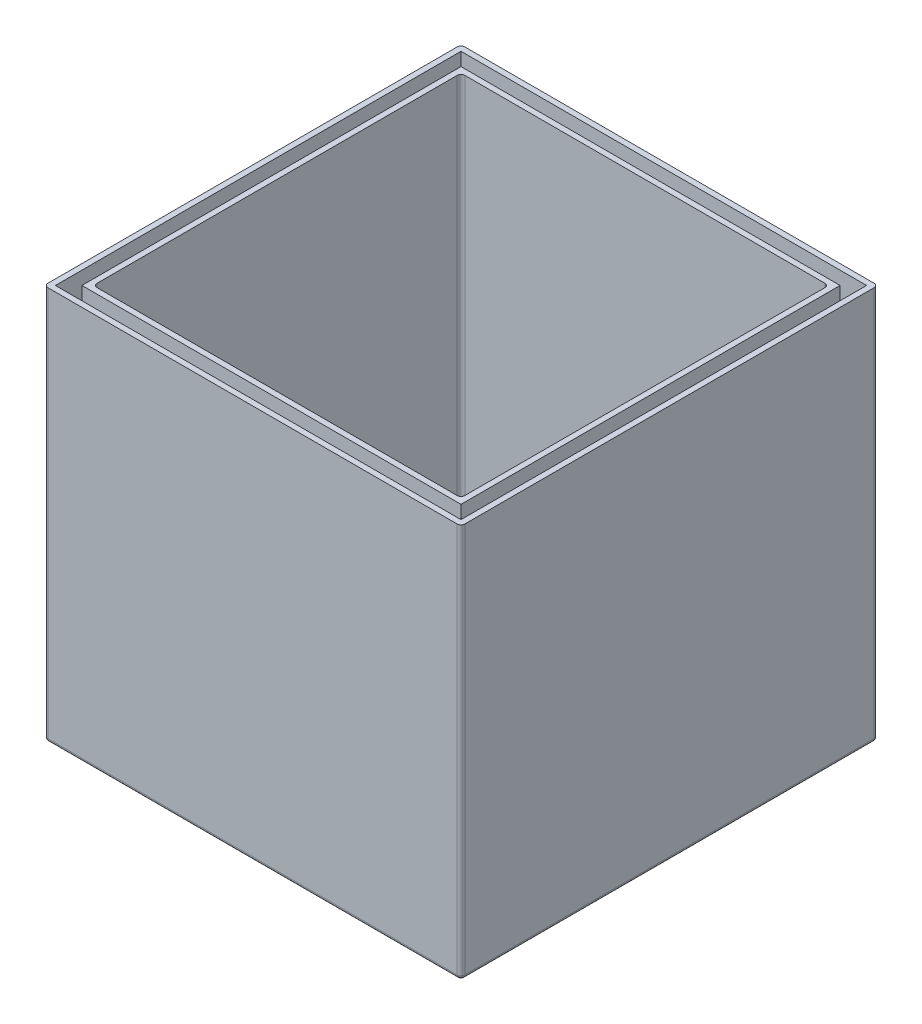
ISO-10303-21;
HEADER;
FILE_DESCRIPTION(('STEP AP214'),'2;1');
FILE_NAME('part.step','',(''),(''),'','','');
FILE_SCHEMA(('AUTOMOTIVE_DESIGN { 1 0 10303 214 1 1 1 1 }'));
ENDSEC;
DATA;
#1=APPLICATION_CONTEXT('core data for automotive mechanical design processes');
#2=APPLICATION_PROTOCOL_DEFINITION('international standard','automotive_design',2000,#1);
#3=PRODUCT_CONTEXT('',#1,'mechanical');
#4=PRODUCT('Part','Part','',(#3));
#5=PRODUCT_RELATED_PRODUCT_CATEGORY('part','',(#4));
#6=PRODUCT_DEFINITION_FORMATION('','',#4);
#7=PRODUCT_DEFINITION_CONTEXT('part definition',#1,'design');
#8=PRODUCT_DEFINITION('design','',#6,#7);
#9=PRODUCT_DEFINITION_SHAPE('','',#8);
#10=(LENGTH_UNIT() NAMED_UNIT(*) SI_UNIT(.MILLI.,.METRE.));
#11=(NAMED_UNIT(*) PLANE_ANGLE_UNIT() SI_UNIT($,.RADIAN.));
#12=(NAMED_UNIT(*) SI_UNIT($,.STERADIAN.) SOLID_ANGLE_UNIT());
#13=UNCERTAINTY_MEASURE_WITH_UNIT(LENGTH_MEASURE(1.E-05),#10,'distance_accuracy_value','');
#14=(GEOMETRIC_REPRESENTATION_CONTEXT(3) GLOBAL_UNCERTAINTY_ASSIGNED_CONTEXT((#13)) GLOBAL_UNIT_ASSIGNED_CONTEXT((#10,
#11,#12)) REPRESENTATION_CONTEXT('',''));
#15=CARTESIAN_POINT('',(0.,0.,0.));
#16=DIRECTION('',(0.,0.,1.));
#17=DIRECTION('',(1.,0.,0.));
#18=AXIS2_PLACEMENT_3D('',#15,#16,#17);
#19=CARTESIAN_POINT('',(0.,205.,-100.));
#20=DIRECTION('',(0.,0.,-1.));
#21=DIRECTION('',(-1.,0.,0.));
#22=AXIS2_PLACEMENT_3D('',#19,#20,#21);
#23=PLANE('',#22);
#24=DIRECTION('',(1.,0.,0.));
#25=VECTOR('',#24,1.);
#26=CARTESIAN_POINT('',(0.,0.,-100.));
#27=LINE('',#26,#25);
#28=CARTESIAN_POINT('',(-100.,0.,-100.));
#29=VERTEX_POINT('',#28);
#30=CARTESIAN_POINT('',(100.,0.,-100.));
#31=VERTEX_POINT('',#30);
#32=EDGE_CURVE('E411',#29,#31,#27,.T.);
#33=ORIENTED_EDGE('',*,*,#32,.F.);
#34=DIRECTION('',(0.,-1.,0.));
#35=VECTOR('',#34,1.);
#36=CARTESIAN_POINT('',(-100.,205.,-100.));
#37=LINE('',#36,#35);
#38=CARTESIAN_POINT('',(-100.,205.,-100.));
#39=VERTEX_POINT('',#38);
#40=EDGE_CURVE('E498',#39,#29,#37,.T.);
#41=ORIENTED_EDGE('',*,*,#40,.F.);
#42=DIRECTION('',(1.,0.,0.));
#43=VECTOR('',#42,1.);
#44=CARTESIAN_POINT('',(0.,205.,-100.));
#45=LINE('',#44,#43);
#46=CARTESIAN_POINT('',(100.,205.,-100.));
#47=VERTEX_POINT('',#46);
#48=EDGE_CURVE('E470',#39,#47,#45,.T.);
#49=ORIENTED_EDGE('',*,*,#48,.T.);
#50=DIRECTION('',(0.,-1.,0.));
#51=VECTOR('',#50,1.);
#52=CARTESIAN_POINT('',(100.,205.,-100.));
#53=LINE('',#52,#51);
#54=EDGE_CURVE('E481',#47,#31,#53,.T.);
#55=ORIENTED_EDGE('',*,*,#54,.T.);
#56=EDGE_LOOP('',(#33,#41,#49,#55));
#57=FACE_BOUND('',#56,.T.);
#58=ADVANCED_FACE('F214',(#57),#23,.T.);
#59=CARTESIAN_POINT('',(-100.,205.,0.));
#60=DIRECTION('',(1.,0.,0.));
#61=DIRECTION('',(0.,0.,-1.));
#62=AXIS2_PLACEMENT_3D('',#59,#60,#61);
#63=PLANE('',#62);
#64=DIRECTION('',(0.,0.,1.));
#65=VECTOR('',#64,1.);
#66=CARTESIAN_POINT('',(-100.,0.,0.));
#67=LINE('',#66,#65);
#68=CARTESIAN_POINT('',(-100.,0.,100.));
#69=VERTEX_POINT('',#68);
#70=EDGE_CURVE('E483',#29,#69,#67,.T.);
#71=ORIENTED_EDGE('',*,*,#70,.T.);
#72=DIRECTION('',(0.,-1.,0.));
#73=VECTOR('',#72,1.);
#74=CARTESIAN_POINT('',(-100.,205.,100.));
#75=LINE('',#74,#73);
#76=CARTESIAN_POINT('',(-100.,205.,100.));
#77=VERTEX_POINT('',#76);
#78=EDGE_CURVE('E495',#77,#69,#75,.T.);
#79=ORIENTED_EDGE('',*,*,#78,.F.);
#80=DIRECTION('',(0.,0.,1.));
#81=VECTOR('',#80,1.);
#82=CARTESIAN_POINT('',(-100.,205.,0.));
#83=LINE('',#82,#81);
#84=EDGE_CURVE('E473',#39,#77,#83,.T.);
#85=ORIENTED_EDGE('',*,*,#84,.F.);
#86=ORIENTED_EDGE('',*,*,#40,.T.);
#87=EDGE_LOOP('',(#71,#79,#85,#86));
#88=FACE_BOUND('',#87,.T.);
#89=ADVANCED_FACE('F719',(#88),#63,.F.);
#90=CARTESIAN_POINT('',(0.,205.,100.));
#91=DIRECTION('',(0.,0.,-1.));
#92=DIRECTION('',(-1.,0.,0.));
#93=AXIS2_PLACEMENT_3D('',#90,#91,#92);
#94=PLANE('',#93);
#95=DIRECTION('',(1.,0.,0.));
#96=VECTOR('',#95,1.);
#97=CARTESIAN_POINT('',(0.,0.,100.));
#98=LINE('',#97,#96);
#99=CARTESIAN_POINT('',(100.,0.,100.));
#100=VERTEX_POINT('',#99);
#101=EDGE_CURVE('E486',#69,#100,#98,.T.);
#102=ORIENTED_EDGE('',*,*,#101,.T.);
#103=DIRECTION('',(0.,-1.,0.));
#104=VECTOR('',#103,1.);
#105=CARTESIAN_POINT('',(100.,205.,100.));
#106=LINE('',#105,#104);
#107=CARTESIAN_POINT('',(100.,205.,100.));
#108=VERTEX_POINT('',#107);
#109=EDGE_CURVE('E492',#108,#100,#106,.T.);
#110=ORIENTED_EDGE('',*,*,#109,.F.);
#111=DIRECTION('',(1.,0.,0.));
#112=VECTOR('',#111,1.);
#113=CARTESIAN_POINT('',(0.,205.,100.));
#114=LINE('',#113,#112);
#115=EDGE_CURVE('E476',#77,#108,#114,.T.);
#116=ORIENTED_EDGE('',*,*,#115,.F.);
#117=ORIENTED_EDGE('',*,*,#78,.T.);
#118=EDGE_LOOP('',(#102,#110,#116,#117));
#119=FACE_BOUND('',#118,.T.);
#120=ADVANCED_FACE('F725',(#119),#94,.F.);
#121=CARTESIAN_POINT('',(0.,205.,-97.));
#122=DIRECTION('',(0.,0.,-1.));
#123=DIRECTION('',(-1.,0.,0.));
#124=AXIS2_PLACEMENT_3D('',#121,#122,#123);
#125=PLANE('',#124);
#126=DIRECTION('',(1.,0.,0.));
#127=VECTOR('',#126,1.);
#128=CARTESIAN_POINT('',(0.,205.,-97.));
#129=LINE('',#128,#127);
#130=CARTESIAN_POINT('',(-95.,205.,-97.));
#131=VERTEX_POINT('',#130);
#132=CARTESIAN_POINT('',(95.,205.,-97.));
#133=VERTEX_POINT('',#132);
#134=EDGE_CURVE('E457',#131,#133,#129,.T.);
#135=ORIENTED_EDGE('',*,*,#134,.F.);
#136=DIRECTION('',(0.,-1.,0.));
#137=VECTOR('',#136,1.);
#138=CARTESIAN_POINT('',(-95.,205.,-97.));
#139=LINE('',#138,#137);
#140=CARTESIAN_POINT('',(-95.,2.,-97.));
#141=VERTEX_POINT('',#140);
#142=EDGE_CURVE('E231',#131,#141,#139,.T.);
#143=ORIENTED_EDGE('',*,*,#142,.T.);
#144=DIRECTION('',(1.,0.,0.));
#145=VECTOR('',#144,1.);
#146=CARTESIAN_POINT('',(0.,2.,-97.));
#147=LINE('',#146,#145);
#148=CARTESIAN_POINT('',(95.,2.,-97.));
#149=VERTEX_POINT('',#148);
#150=EDGE_CURVE('E236',#141,#149,#147,.T.);
#151=ORIENTED_EDGE('',*,*,#150,.T.);
#152=DIRECTION('',(0.,-1.,0.));
#153=VECTOR('',#152,1.);
#154=CARTESIAN_POINT('',(95.,205.,-97.));
#155=LINE('',#154,#153);
#156=EDGE_CURVE('E563',#149,#133,#155,.F.);
#157=ORIENTED_EDGE('',*,*,#156,.T.);
#158=EDGE_LOOP('',(#135,#143,#151,#157));
#159=FACE_BOUND('',#158,.T.);
#160=ADVANCED_FACE('F663',(#159),#125,.F.);
#161=CARTESIAN_POINT('',(97.,205.,0.));
#162=DIRECTION('',(1.,0.,0.));
#163=DIRECTION('',(0.,0.,-1.));
#164=AXIS2_PLACEMENT_3D('',#161,#162,#163);
#165=PLANE('',#164);
#166=DIRECTION('',(0.,0.,1.));
#167=VECTOR('',#166,1.);
#168=CARTESIAN_POINT('',(97.,205.,0.));
#169=LINE('',#168,#167);
#170=CARTESIAN_POINT('',(97.,205.,-95.));
#171=VERTEX_POINT('',#170);
#172=CARTESIAN_POINT('',(97.,205.,95.));
#173=VERTEX_POINT('',#172);
#174=EDGE_CURVE('E460',#171,#173,#169,.T.);
#175=ORIENTED_EDGE('',*,*,#174,.F.);
#176=DIRECTION('',(0.,-1.,0.));
#177=VECTOR('',#176,1.);
#178=CARTESIAN_POINT('',(97.,0.,-95.));
#179=LINE('',#178,#177);
#180=CARTESIAN_POINT('',(97.,2.,-95.));
#181=VERTEX_POINT('',#180);
#182=EDGE_CURVE('E540',#171,#181,#179,.T.);
#183=ORIENTED_EDGE('',*,*,#182,.T.);
#184=DIRECTION('',(0.,0.,1.));
#185=VECTOR('',#184,1.);
#186=CARTESIAN_POINT('',(97.,2.,0.));
#187=LINE('',#186,#185);
#188=CARTESIAN_POINT('',(97.,2.,95.));
#189=VERTEX_POINT('',#188);
#190=EDGE_CURVE('E537',#181,#189,#187,.T.);
#191=ORIENTED_EDGE('',*,*,#190,.T.);
#192=DIRECTION('',(0.,-1.,0.));
#193=VECTOR('',#192,1.);
#194=CARTESIAN_POINT('',(97.,205.,95.));
#195=LINE('',#194,#193);
#196=EDGE_CURVE('E535',#189,#173,#195,.F.);
#197=ORIENTED_EDGE('',*,*,#196,.T.);
#198=EDGE_LOOP('',(#175,#183,#191,#197));
#199=FACE_BOUND('',#198,.T.);
#200=ADVANCED_FACE('F705',(#199),#165,.F.);
#201=CARTESIAN_POINT('',(0.,205.,97.));
#202=DIRECTION('',(0.,0.,-1.));
#203=DIRECTION('',(-1.,0.,0.));
#204=AXIS2_PLACEMENT_3D('',#201,#202,#203);
#205=PLANE('',#204);
#206=DIRECTION('',(1.,0.,0.));
#207=VECTOR('',#206,1.);
#208=CARTESIAN_POINT('',(-97.,2.,97.));
#209=LINE('',#208,#207);
#210=CARTESIAN_POINT('',(95.,2.,97.));
#211=VERTEX_POINT('',#210);
#212=CARTESIAN_POINT('',(-95.,2.,97.));
#213=VERTEX_POINT('',#212);
#214=EDGE_CURVE('E553',#211,#213,#209,.F.);
#215=ORIENTED_EDGE('',*,*,#214,.T.);
#216=DIRECTION('',(0.,-1.,0.));
#217=VECTOR('',#216,1.);
#218=CARTESIAN_POINT('',(-95.,205.,97.));
#219=LINE('',#218,#217);
#220=CARTESIAN_POINT('',(-95.,205.,97.));
#221=VERTEX_POINT('',#220);
#222=EDGE_CURVE('E555',#213,#221,#219,.F.);
#223=ORIENTED_EDGE('',*,*,#222,.T.);
#224=DIRECTION('',(1.,0.,0.));
#225=VECTOR('',#224,1.);
#226=CARTESIAN_POINT('',(0.,205.,97.));
#227=LINE('',#226,#225);
#228=CARTESIAN_POINT('',(95.,205.,97.));
#229=VERTEX_POINT('',#228);
#230=EDGE_CURVE('E464',#221,#229,#227,.T.);
#231=ORIENTED_EDGE('',*,*,#230,.T.);
#232=DIRECTION('',(0.,-1.,0.));
#233=VECTOR('',#232,1.);
#234=CARTESIAN_POINT('',(95.,205.,97.));
#235=LINE('',#234,#233);
#236=EDGE_CURVE('E551',#229,#211,#235,.T.);
#237=ORIENTED_EDGE('',*,*,#236,.T.);
#238=EDGE_LOOP('',(#215,#223,#231,#237));
#239=FACE_BOUND('',#238,.T.);
#240=ADVANCED_FACE('F708',(#239),#205,.T.);
#241=CARTESIAN_POINT('',(-97.,205.,0.));
#242=DIRECTION('',(1.,0.,0.));
#243=DIRECTION('',(0.,0.,-1.));
#244=AXIS2_PLACEMENT_3D('',#241,#242,#243);
#245=PLANE('',#244);
#246=DIRECTION('',(0.,0.,1.));
#247=VECTOR('',#246,1.);
#248=CARTESIAN_POINT('',(-97.,2.,-97.));
#249=LINE('',#248,#247);
#250=CARTESIAN_POINT('',(-97.,2.,95.));
#251=VERTEX_POINT('',#250);
#252=CARTESIAN_POINT('',(-97.,2.,-95.));
#253=VERTEX_POINT('',#252);
#254=EDGE_CURVE('E559',#251,#253,#249,.F.);
#255=ORIENTED_EDGE('',*,*,#254,.T.);
#256=DIRECTION('',(0.,-1.,0.));
#257=VECTOR('',#256,1.);
#258=CARTESIAN_POINT('',(-97.,205.,-95.));
#259=LINE('',#258,#257);
#260=CARTESIAN_POINT('',(-97.,205.,-95.));
#261=VERTEX_POINT('',#260);
#262=EDGE_CURVE('E561',#253,#261,#259,.F.);
#263=ORIENTED_EDGE('',*,*,#262,.T.);
#264=DIRECTION('',(0.,0.,1.));
#265=VECTOR('',#264,1.);
#266=CARTESIAN_POINT('',(-97.,205.,0.));
#267=LINE('',#266,#265);
#268=CARTESIAN_POINT('',(-97.,205.,95.));
#269=VERTEX_POINT('',#268);
#270=EDGE_CURVE('E467',#261,#269,#267,.T.);
#271=ORIENTED_EDGE('',*,*,#270,.T.);
#272=DIRECTION('',(0.,-1.,0.));
#273=VECTOR('',#272,1.);
#274=CARTESIAN_POINT('',(-97.,0.,95.));
#275=LINE('',#274,#273);
#276=EDGE_CURVE('E557',#269,#251,#275,.T.);
#277=ORIENTED_EDGE('',*,*,#276,.T.);
#278=EDGE_LOOP('',(#255,#263,#271,#277));
#279=FACE_BOUND('',#278,.T.);
#280=ADVANCED_FACE('F673',(#279),#245,.T.);
#281=CARTESIAN_POINT('',(100.,205.,0.));
#282=DIRECTION('',(1.,0.,0.));
#283=DIRECTION('',(0.,0.,-1.));
#284=AXIS2_PLACEMENT_3D('',#281,#282,#283);
#285=PLANE('',#284);
#286=DIRECTION('',(0.,0.,1.));
#287=VECTOR('',#286,1.);
#288=CARTESIAN_POINT('',(100.,0.,0.));
#289=LINE('',#288,#287);
#290=EDGE_CURVE('E461',#31,#100,#289,.T.);
#291=ORIENTED_EDGE('',*,*,#290,.F.);
#292=ORIENTED_EDGE('',*,*,#54,.F.);
#293=DIRECTION('',(0.,0.,1.));
#294=VECTOR('',#293,1.);
#295=CARTESIAN_POINT('',(100.,205.,0.));
#296=LINE('',#295,#294);
#297=EDGE_CURVE('E478',#47,#108,#296,.T.);
#298=ORIENTED_EDGE('',*,*,#297,.T.);
#299=ORIENTED_EDGE('',*,*,#109,.T.);
#300=EDGE_LOOP('',(#291,#292,#298,#299));
#301=FACE_BOUND('',#300,.T.);
#302=ADVANCED_FACE('F715',(#301),#285,.T.);
#303=CARTESIAN_POINT('',(0.,205.,0.));
#304=DIRECTION('',(0.,1.,0.));
#305=DIRECTION('',(0.,0.,1.));
#306=AXIS2_PLACEMENT_3D('',#303,#304,#305);
#307=PLANE('',#306);
#308=ORIENTED_EDGE('',*,*,#270,.F.);
#309=CARTESIAN_POINT('',(-95.,205.,-95.));
#310=DIRECTION('',(0.,1.,0.));
#311=DIRECTION('',(0.,0.,1.));
#312=AXIS2_PLACEMENT_3D('',#309,#310,#311);
#313=CIRCLE('',#312,2.);
#314=EDGE_CURVE('E575',#261,#131,#313,.F.);
#315=ORIENTED_EDGE('',*,*,#314,.T.);
#316=ORIENTED_EDGE('',*,*,#134,.T.);
#317=CARTESIAN_POINT('',(95.,205.,-95.));
#318=DIRECTION('',(0.,1.,0.));
#319=DIRECTION('',(0.,0.,1.));
#320=AXIS2_PLACEMENT_3D('',#317,#318,#319);
#321=CIRCLE('',#320,2.);
#322=EDGE_CURVE('E577',#133,#171,#321,.F.);
#323=ORIENTED_EDGE('',*,*,#322,.T.);
#324=ORIENTED_EDGE('',*,*,#174,.T.);
#325=CARTESIAN_POINT('',(95.,205.,95.));
#326=DIRECTION('',(0.,1.,0.));
#327=DIRECTION('',(0.,0.,1.));
#328=AXIS2_PLACEMENT_3D('',#325,#326,#327);
#329=CIRCLE('',#328,2.);
#330=EDGE_CURVE('E15',#173,#229,#329,.F.);
#331=ORIENTED_EDGE('',*,*,#330,.T.);
#332=ORIENTED_EDGE('',*,*,#230,.F.);
#333=CARTESIAN_POINT('',(-95.,205.,95.));
#334=DIRECTION('',(0.,1.,0.));
#335=DIRECTION('',(0.,0.,1.));
#336=AXIS2_PLACEMENT_3D('',#333,#334,#335);
#337=CIRCLE('',#336,2.);
#338=EDGE_CURVE('E223',#221,#269,#337,.F.);
#339=ORIENTED_EDGE('',*,*,#338,.T.);
#340=EDGE_LOOP('',(#308,#315,#316,#323,#324,#331,#332,#339));
#341=FACE_BOUND('',#340,.T.);
#342=ORIENTED_EDGE('',*,*,#48,.F.);
#343=ORIENTED_EDGE('',*,*,#84,.T.);
#344=ORIENTED_EDGE('',*,*,#115,.T.);
#345=ORIENTED_EDGE('',*,*,#297,.F.);
#346=EDGE_LOOP('',(#342,#343,#344,#345));
#347=FACE_BOUND('',#346,.T.);
#348=ADVANCED_FACE('F666',(#341,#347),#307,.T.);
#349=CARTESIAN_POINT('',(0.,0.,0.));
#350=DIRECTION('',(0.,1.,0.));
#351=DIRECTION('',(0.,0.,1.));
#352=AXIS2_PLACEMENT_3D('',#349,#350,#351);
#353=PLANE('',#352);
#354=DIRECTION('',(0.,0.,1.));
#355=VECTOR('',#354,1.);
#356=CARTESIAN_POINT('',(-107.,0.,0.));
#357=LINE('',#356,#355);
#358=CARTESIAN_POINT('',(-107.,0.,-107.));
#359=VERTEX_POINT('',#358);
#360=CARTESIAN_POINT('',(-107.,0.,107.));
#361=VERTEX_POINT('',#360);
#362=EDGE_CURVE('E408',#359,#361,#357,.T.);
#363=ORIENTED_EDGE('',*,*,#362,.T.);
#364=DIRECTION('',(1.,0.,0.));
#365=VECTOR('',#364,1.);
#366=CARTESIAN_POINT('',(0.,0.,107.));
#367=LINE('',#366,#365);
#368=CARTESIAN_POINT('',(107.,0.,107.));
#369=VERTEX_POINT('',#368);
#370=EDGE_CURVE('E426',#361,#369,#367,.T.);
#371=ORIENTED_EDGE('',*,*,#370,.T.);
#372=DIRECTION('',(0.,0.,1.));
#373=VECTOR('',#372,1.);
#374=CARTESIAN_POINT('',(107.,0.,0.));
#375=LINE('',#374,#373);
#376=CARTESIAN_POINT('',(107.,0.,-107.));
#377=VERTEX_POINT('',#376);
#378=EDGE_CURVE('E428',#377,#369,#375,.T.);
#379=ORIENTED_EDGE('',*,*,#378,.F.);
#380=DIRECTION('',(1.,0.,0.));
#381=VECTOR('',#380,1.);
#382=CARTESIAN_POINT('',(0.,0.,-107.));
#383=LINE('',#382,#381);
#384=EDGE_CURVE('E447',#359,#377,#383,.T.);
#385=ORIENTED_EDGE('',*,*,#384,.F.);
#386=EDGE_LOOP('',(#363,#371,#379,#385));
#387=FACE_BOUND('',#386,.T.);
#388=ORIENTED_EDGE('',*,*,#70,.F.);
#389=ORIENTED_EDGE('',*,*,#32,.T.);
#390=ORIENTED_EDGE('',*,*,#290,.T.);
#391=ORIENTED_EDGE('',*,*,#101,.F.);
#392=EDGE_LOOP('',(#388,#389,#390,#391));
#393=FACE_BOUND('',#392,.T.);
#394=ADVANCED_FACE('F738',(#387,#393),#353,.T.);
#395=DIRECTION('',(1.,0.,0.));
#396=VECTOR('',#395,1.);
#397=CARTESIAN_POINT('',(97.,0.,95.));
#398=LINE('',#397,#396);
#399=CARTESIAN_POINT('',(-95.,0.,95.));
#400=VERTEX_POINT('',#399);
#401=CARTESIAN_POINT('',(95.,0.,95.));
#402=VERTEX_POINT('',#401);
#403=EDGE_CURVE('E546',#400,#402,#398,.T.);
#404=ORIENTED_EDGE('',*,*,#403,.T.);
#405=DIRECTION('',(0.,0.,1.));
#406=VECTOR('',#405,1.);
#407=CARTESIAN_POINT('',(95.,0.,0.));
#408=LINE('',#407,#406);
#409=CARTESIAN_POINT('',(95.,0.,-95.));
#410=VERTEX_POINT('',#409);
#411=EDGE_CURVE('E548',#402,#410,#408,.F.);
#412=ORIENTED_EDGE('',*,*,#411,.T.);
#413=DIRECTION('',(1.,0.,0.));
#414=VECTOR('',#413,1.);
#415=CARTESIAN_POINT('',(0.,0.,-95.));
#416=LINE('',#415,#414);
#417=CARTESIAN_POINT('',(-95.,0.,-95.));
#418=VERTEX_POINT('',#417);
#419=EDGE_CURVE('E542',#410,#418,#416,.F.);
#420=ORIENTED_EDGE('',*,*,#419,.T.);
#421=DIRECTION('',(0.,0.,1.));
#422=VECTOR('',#421,1.);
#423=CARTESIAN_POINT('',(-95.,0.,97.));
#424=LINE('',#423,#422);
#425=EDGE_CURVE('E544',#418,#400,#424,.T.);
#426=ORIENTED_EDGE('',*,*,#425,.T.);
#427=EDGE_LOOP('',(#404,#412,#420,#426));
#428=FACE_BOUND('',#427,.T.);
#429=ADVANCED_FACE('F692',(#428),#353,.T.);
#430=CARTESIAN_POINT('',(-107.,205.,0.));
#431=DIRECTION('',(1.,0.,0.));
#432=DIRECTION('',(0.,0.,-1.));
#433=AXIS2_PLACEMENT_3D('',#430,#431,#432);
#434=PLANE('',#433);
#435=ORIENTED_EDGE('',*,*,#362,.F.);
#436=DIRECTION('',(0.,-1.,0.));
#437=VECTOR('',#436,1.);
#438=CARTESIAN_POINT('',(-107.,205.,-107.));
#439=LINE('',#438,#437);
#440=CARTESIAN_POINT('',(-107.,205.,-107.));
#441=VERTEX_POINT('',#440);
#442=EDGE_CURVE('E401',#441,#359,#439,.T.);
#443=ORIENTED_EDGE('',*,*,#442,.F.);
#444=DIRECTION('',(0.,0.,1.));
#445=VECTOR('',#444,1.);
#446=CARTESIAN_POINT('',(-107.,205.,0.));
#447=LINE('',#446,#445);
#448=CARTESIAN_POINT('',(-107.,205.,107.));
#449=VERTEX_POINT('',#448);
#450=EDGE_CURVE('E406',#441,#449,#447,.T.);
#451=ORIENTED_EDGE('',*,*,#450,.T.);
#452=DIRECTION('',(0.,-1.,0.));
#453=VECTOR('',#452,1.);
#454=CARTESIAN_POINT('',(-107.,205.,107.));
#455=LINE('',#454,#453);
#456=EDGE_CURVE('E445',#449,#361,#455,.T.);
#457=ORIENTED_EDGE('',*,*,#456,.T.);
#458=EDGE_LOOP('',(#435,#443,#451,#457));
#459=FACE_BOUND('',#458,.T.);
#460=ADVANCED_FACE('F403',(#459),#434,.T.);
#461=CARTESIAN_POINT('',(0.,205.,-107.));
#462=DIRECTION('',(0.,0.,-1.));
#463=DIRECTION('',(-1.,0.,0.));
#464=AXIS2_PLACEMENT_3D('',#461,#462,#463);
#465=PLANE('',#464);
#466=ORIENTED_EDGE('',*,*,#384,.T.);
#467=DIRECTION('',(0.,-1.,0.));
#468=VECTOR('',#467,1.);
#469=CARTESIAN_POINT('',(107.,205.,-107.));
#470=LINE('',#469,#468);
#471=CARTESIAN_POINT('',(107.,205.,-107.));
#472=VERTEX_POINT('',#471);
#473=EDGE_CURVE('E412',#472,#377,#470,.T.);
#474=ORIENTED_EDGE('',*,*,#473,.F.);
#475=DIRECTION('',(1.,0.,0.));
#476=VECTOR('',#475,1.);
#477=CARTESIAN_POINT('',(0.,205.,-107.));
#478=LINE('',#477,#476);
#479=EDGE_CURVE('E415',#441,#472,#478,.T.);
#480=ORIENTED_EDGE('',*,*,#479,.F.);
#481=ORIENTED_EDGE('',*,*,#442,.T.);
#482=EDGE_LOOP('',(#466,#474,#480,#481));
#483=FACE_BOUND('',#482,.T.);
#484=ADVANCED_FACE('F416',(#483),#465,.F.);
#485=CARTESIAN_POINT('',(107.,205.,0.));
#486=DIRECTION('',(1.,0.,0.));
#487=DIRECTION('',(0.,0.,-1.));
#488=AXIS2_PLACEMENT_3D('',#485,#486,#487);
#489=PLANE('',#488);
#490=ORIENTED_EDGE('',*,*,#378,.T.);
#491=DIRECTION('',(0.,-1.,0.));
#492=VECTOR('',#491,1.);
#493=CARTESIAN_POINT('',(107.,205.,107.));
#494=LINE('',#493,#492);
#495=CARTESIAN_POINT('',(107.,205.,107.));
#496=VERTEX_POINT('',#495);
#497=EDGE_CURVE('E453',#496,#369,#494,.T.);
#498=ORIENTED_EDGE('',*,*,#497,.F.);
#499=DIRECTION('',(0.,0.,1.));
#500=VECTOR('',#499,1.);
#501=CARTESIAN_POINT('',(107.,205.,0.));
#502=LINE('',#501,#500);
#503=EDGE_CURVE('E420',#472,#496,#502,.T.);
#504=ORIENTED_EDGE('',*,*,#503,.F.);
#505=ORIENTED_EDGE('',*,*,#473,.T.);
#506=EDGE_LOOP('',(#490,#498,#504,#505));
#507=FACE_BOUND('',#506,.T.);
#508=ADVANCED_FACE('F767',(#507),#489,.F.);
#509=CARTESIAN_POINT('',(0.,205.,107.));
#510=DIRECTION('',(0.,0.,-1.));
#511=DIRECTION('',(-1.,0.,0.));
#512=AXIS2_PLACEMENT_3D('',#509,#510,#511);
#513=PLANE('',#512);
#514=ORIENTED_EDGE('',*,*,#370,.F.);
#515=ORIENTED_EDGE('',*,*,#456,.F.);
#516=DIRECTION('',(1.,0.,0.));
#517=VECTOR('',#516,1.);
#518=CARTESIAN_POINT('',(0.,205.,107.));
#519=LINE('',#518,#517);
#520=EDGE_CURVE('E425',#449,#496,#519,.T.);
#521=ORIENTED_EDGE('',*,*,#520,.T.);
#522=ORIENTED_EDGE('',*,*,#497,.T.);
#523=EDGE_LOOP('',(#514,#515,#521,#522));
#524=FACE_BOUND('',#523,.T.);
#525=ADVANCED_FACE('F770',(#524),#513,.T.);
#526=CARTESIAN_POINT('',(0.,205.,0.));
#527=DIRECTION('',(0.,1.,0.));
#528=DIRECTION('',(0.,0.,1.));
#529=AXIS2_PLACEMENT_3D('',#526,#527,#528);
#530=PLANE('',#529);
#531=ORIENTED_EDGE('',*,*,#450,.F.);
#532=ORIENTED_EDGE('',*,*,#479,.T.);
#533=ORIENTED_EDGE('',*,*,#503,.T.);
#534=ORIENTED_EDGE('',*,*,#520,.F.);
#535=EDGE_LOOP('',(#531,#532,#533,#534));
#536=FACE_BOUND('',#535,.T.);
#537=DIRECTION('',(0.,0.,1.));
#538=VECTOR('',#537,1.);
#539=CARTESIAN_POINT('',(110.,205.,0.));
#540=LINE('',#539,#538);
#541=CARTESIAN_POINT('',(110.,205.,-108.));
#542=VERTEX_POINT('',#541);
#543=CARTESIAN_POINT('',(110.,205.,108.));
#544=VERTEX_POINT('',#543);
#545=EDGE_CURVE('E442',#542,#544,#540,.T.);
#546=ORIENTED_EDGE('',*,*,#545,.F.);
#547=CARTESIAN_POINT('',(108.,205.,-108.));
#548=DIRECTION('',(0.,1.,0.));
#549=DIRECTION('',(0.,0.,1.));
#550=AXIS2_PLACEMENT_3D('',#547,#548,#549);
#551=CIRCLE('',#550,2.);
#552=CARTESIAN_POINT('',(108.,205.,-110.));
#553=VERTEX_POINT('',#552);
#554=EDGE_CURVE('E573',#542,#553,#551,.T.);
#555=ORIENTED_EDGE('',*,*,#554,.T.);
#556=DIRECTION('',(1.,0.,0.));
#557=VECTOR('',#556,1.);
#558=CARTESIAN_POINT('',(0.,205.,-110.));
#559=LINE('',#558,#557);
#560=CARTESIAN_POINT('',(-108.,205.,-110.));
#561=VERTEX_POINT('',#560);
#562=EDGE_CURVE('E433',#561,#553,#559,.T.);
#563=ORIENTED_EDGE('',*,*,#562,.F.);
#564=CARTESIAN_POINT('',(-108.,205.,-108.));
#565=DIRECTION('',(0.,1.,0.));
#566=DIRECTION('',(0.,0.,1.));
#567=AXIS2_PLACEMENT_3D('',#564,#565,#566);
#568=CIRCLE('',#567,2.);
#569=CARTESIAN_POINT('',(-110.,205.,-108.));
#570=VERTEX_POINT('',#569);
#571=EDGE_CURVE('E567',#561,#570,#568,.T.);
#572=ORIENTED_EDGE('',*,*,#571,.T.);
#573=DIRECTION('',(0.,0.,1.));
#574=VECTOR('',#573,1.);
#575=CARTESIAN_POINT('',(-110.,205.,0.));
#576=LINE('',#575,#574);
#577=CARTESIAN_POINT('',(-110.,205.,108.));
#578=VERTEX_POINT('',#577);
#579=EDGE_CURVE('E436',#570,#578,#576,.T.);
#580=ORIENTED_EDGE('',*,*,#579,.T.);
#581=CARTESIAN_POINT('',(-108.,205.,108.));
#582=DIRECTION('',(0.,1.,0.));
#583=DIRECTION('',(0.,0.,1.));
#584=AXIS2_PLACEMENT_3D('',#581,#582,#583);
#585=CIRCLE('',#584,2.);
#586=CARTESIAN_POINT('',(-108.,205.,110.));
#587=VERTEX_POINT('',#586);
#588=EDGE_CURVE('E569',#578,#587,#585,.T.);
#589=ORIENTED_EDGE('',*,*,#588,.T.);
#590=DIRECTION('',(1.,0.,0.));
#591=VECTOR('',#590,1.);
#592=CARTESIAN_POINT('',(0.,205.,110.));
#593=LINE('',#592,#591);
#594=CARTESIAN_POINT('',(108.,205.,110.));
#595=VERTEX_POINT('',#594);
#596=EDGE_CURVE('E439',#587,#595,#593,.T.);
#597=ORIENTED_EDGE('',*,*,#596,.T.);
#598=CARTESIAN_POINT('',(108.,205.,108.));
#599=DIRECTION('',(0.,1.,0.));
#600=DIRECTION('',(0.,0.,1.));
#601=AXIS2_PLACEMENT_3D('',#598,#599,#600);
#602=CIRCLE('',#601,2.);
#603=EDGE_CURVE('E571',#595,#544,#602,.T.);
#604=ORIENTED_EDGE('',*,*,#603,.T.);
#605=EDGE_LOOP('',(#546,#555,#563,#572,#580,#589,#597,#604));
#606=FACE_BOUND('',#605,.T.);
#607=ADVANCED_FACE('F422',(#536,#606),#530,.T.);
#608=CARTESIAN_POINT('',(0.,-3.,0.));
#609=DIRECTION('',(0.,1.,0.));
#610=DIRECTION('',(0.,0.,1.));
#611=AXIS2_PLACEMENT_3D('',#608,#609,#610);
#612=PLANE('',#611);
#613=DIRECTION('',(0.,0.,-1.));
#614=VECTOR('',#613,1.);
#615=CARTESIAN_POINT('',(-108.,-3.,0.));
#616=LINE('',#615,#614);
#617=CARTESIAN_POINT('',(-108.,-3.,108.));
#618=VERTEX_POINT('',#617);
#619=CARTESIAN_POINT('',(-108.,-3.,-108.));
#620=VERTEX_POINT('',#619);
#621=EDGE_CURVE('E505',#618,#620,#616,.T.);
#622=ORIENTED_EDGE('',*,*,#621,.T.);
#623=DIRECTION('',(1.,0.,0.));
#624=VECTOR('',#623,1.);
#625=CARTESIAN_POINT('',(0.,-3.,-108.));
#626=LINE('',#625,#624);
#627=CARTESIAN_POINT('',(108.,-3.,-108.));
#628=VERTEX_POINT('',#627);
#629=EDGE_CURVE('E507',#620,#628,#626,.T.);
#630=ORIENTED_EDGE('',*,*,#629,.T.);
#631=DIRECTION('',(0.,0.,1.));
#632=VECTOR('',#631,1.);
#633=CARTESIAN_POINT('',(108.,-3.,0.));
#634=LINE('',#633,#632);
#635=CARTESIAN_POINT('',(108.,-3.,108.));
#636=VERTEX_POINT('',#635);
#637=EDGE_CURVE('E501',#628,#636,#634,.T.);
#638=ORIENTED_EDGE('',*,*,#637,.T.);
#639=DIRECTION('',(-1.,0.,0.));
#640=VECTOR('',#639,1.);
#641=CARTESIAN_POINT('',(0.,-3.,108.));
#642=LINE('',#641,#640);
#643=EDGE_CURVE('E503',#636,#618,#642,.T.);
#644=ORIENTED_EDGE('',*,*,#643,.T.);
#645=EDGE_LOOP('',(#622,#630,#638,#644));
#646=FACE_BOUND('',#645,.T.);
#647=ADVANCED_FACE('F743',(#646),#612,.F.);
#648=CARTESIAN_POINT('',(110.,-3.,-110.));
#649=DIRECTION('',(-1.,0.,0.));
#650=DIRECTION('',(0.,0.,1.));
#651=AXIS2_PLACEMENT_3D('',#648,#649,#650);
#652=PLANE('',#651);
#653=DIRECTION('',(0.,0.,1.));
#654=VECTOR('',#653,1.);
#655=CARTESIAN_POINT('',(110.,-1.,-110.));
#656=LINE('',#655,#654);
#657=CARTESIAN_POINT('',(110.,-1.,108.));
#658=VERTEX_POINT('',#657);
#659=CARTESIAN_POINT('',(110.,-1.,-108.));
#660=VERTEX_POINT('',#659);
#661=EDGE_CURVE('E531',#658,#660,#656,.F.);
#662=ORIENTED_EDGE('',*,*,#661,.T.);
#663=DIRECTION('',(0.,1.,0.));
#664=VECTOR('',#663,1.);
#665=CARTESIAN_POINT('',(110.,-3.,-108.));
#666=LINE('',#665,#664);
#667=EDGE_CURVE('E533',#660,#542,#666,.T.);
#668=ORIENTED_EDGE('',*,*,#667,.T.);
#669=ORIENTED_EDGE('',*,*,#545,.T.);
#670=DIRECTION('',(0.,1.,0.));
#671=VECTOR('',#670,1.);
#672=CARTESIAN_POINT('',(110.,-3.,108.));
#673=LINE('',#672,#671);
#674=EDGE_CURVE('E529',#544,#658,#673,.F.);
#675=ORIENTED_EDGE('',*,*,#674,.T.);
#676=EDGE_LOOP('',(#662,#668,#669,#675));
#677=FACE_BOUND('',#676,.T.);
#678=ADVANCED_FACE('F739',(#677),#652,.F.);
#679=CARTESIAN_POINT('',(-110.,-3.,110.));
#680=DIRECTION('',(0.,0.,-1.));
#681=DIRECTION('',(-1.,0.,0.));
#682=AXIS2_PLACEMENT_3D('',#679,#680,#681);
#683=PLANE('',#682);
#684=DIRECTION('',(-1.,0.,0.));
#685=VECTOR('',#684,1.);
#686=CARTESIAN_POINT('',(-110.,-1.,110.));
#687=LINE('',#686,#685);
#688=CARTESIAN_POINT('',(-108.,-1.,110.));
#689=VERTEX_POINT('',#688);
#690=CARTESIAN_POINT('',(108.,-1.,110.));
#691=VERTEX_POINT('',#690);
#692=EDGE_CURVE('E525',#689,#691,#687,.F.);
#693=ORIENTED_EDGE('',*,*,#692,.T.);
#694=DIRECTION('',(0.,1.,0.));
#695=VECTOR('',#694,1.);
#696=CARTESIAN_POINT('',(108.,-3.,110.));
#697=LINE('',#696,#695);
#698=EDGE_CURVE('E527',#691,#595,#697,.T.);
#699=ORIENTED_EDGE('',*,*,#698,.T.);
#700=ORIENTED_EDGE('',*,*,#596,.F.);
#701=DIRECTION('',(0.,1.,0.));
#702=VECTOR('',#701,1.);
#703=CARTESIAN_POINT('',(-108.,-3.,110.));
#704=LINE('',#703,#702);
#705=EDGE_CURVE('E523',#587,#689,#704,.F.);
#706=ORIENTED_EDGE('',*,*,#705,.T.);
#707=EDGE_LOOP('',(#693,#699,#700,#706));
#708=FACE_BOUND('',#707,.T.);
#709=ADVANCED_FACE('F742',(#708),#683,.F.);
#710=CARTESIAN_POINT('',(-110.,-3.,-110.));
#711=DIRECTION('',(1.,0.,0.));
#712=DIRECTION('',(0.,0.,-1.));
#713=AXIS2_PLACEMENT_3D('',#710,#711,#712);
#714=PLANE('',#713);
#715=DIRECTION('',(0.,0.,-1.));
#716=VECTOR('',#715,1.);
#717=CARTESIAN_POINT('',(-110.,-1.,-110.));
#718=LINE('',#717,#716);
#719=CARTESIAN_POINT('',(-110.,-1.,-108.));
#720=VERTEX_POINT('',#719);
#721=CARTESIAN_POINT('',(-110.,-1.,108.));
#722=VERTEX_POINT('',#721);
#723=EDGE_CURVE('E519',#720,#722,#718,.F.);
#724=ORIENTED_EDGE('',*,*,#723,.T.);
#725=DIRECTION('',(0.,1.,0.));
#726=VECTOR('',#725,1.);
#727=CARTESIAN_POINT('',(-110.,-3.,108.));
#728=LINE('',#727,#726);
#729=EDGE_CURVE('E521',#722,#578,#728,.T.);
#730=ORIENTED_EDGE('',*,*,#729,.T.);
#731=ORIENTED_EDGE('',*,*,#579,.F.);
#732=DIRECTION('',(0.,1.,0.));
#733=VECTOR('',#732,1.);
#734=CARTESIAN_POINT('',(-110.,-3.,-108.));
#735=LINE('',#734,#733);
#736=EDGE_CURVE('E517',#570,#720,#735,.F.);
#737=ORIENTED_EDGE('',*,*,#736,.T.);
#738=EDGE_LOOP('',(#724,#730,#731,#737));
#739=FACE_BOUND('',#738,.T.);
#740=ADVANCED_FACE('F747',(#739),#714,.F.);
#741=CARTESIAN_POINT('',(-110.,-3.,-110.));
#742=DIRECTION('',(0.,0.,1.));
#743=DIRECTION('',(1.,0.,0.));
#744=AXIS2_PLACEMENT_3D('',#741,#742,#743);
#745=PLANE('',#744);
#746=ORIENTED_EDGE('',*,*,#562,.T.);
#747=DIRECTION('',(0.,1.,0.));
#748=VECTOR('',#747,1.);
#749=CARTESIAN_POINT('',(108.,-3.,-110.));
#750=LINE('',#749,#748);
#751=CARTESIAN_POINT('',(108.,-1.,-110.));
#752=VERTEX_POINT('',#751);
#753=EDGE_CURVE('E515',#553,#752,#750,.F.);
#754=ORIENTED_EDGE('',*,*,#753,.T.);
#755=DIRECTION('',(1.,0.,0.));
#756=VECTOR('',#755,1.);
#757=CARTESIAN_POINT('',(-110.,-1.,-110.));
#758=LINE('',#757,#756);
#759=CARTESIAN_POINT('',(-108.,-1.,-110.));
#760=VERTEX_POINT('',#759);
#761=EDGE_CURVE('E512',#752,#760,#758,.F.);
#762=ORIENTED_EDGE('',*,*,#761,.T.);
#763=DIRECTION('',(0.,1.,0.));
#764=VECTOR('',#763,1.);
#765=CARTESIAN_POINT('',(-108.,-3.,-110.));
#766=LINE('',#765,#764);
#767=EDGE_CURVE('E510',#760,#561,#766,.T.);
#768=ORIENTED_EDGE('',*,*,#767,.T.);
#769=EDGE_LOOP('',(#746,#754,#762,#768));
#770=FACE_BOUND('',#769,.T.);
#771=ADVANCED_FACE('F751',(#770),#745,.F.);
#772=CARTESIAN_POINT('',(-108.,-3.,108.));
#773=DIRECTION('',(0.,1.,0.));
#774=DIRECTION('',(0.,0.,1.));
#775=AXIS2_PLACEMENT_3D('',#772,#773,#774);
#776=CYLINDRICAL_SURFACE('',#775,2.);
#777=ORIENTED_EDGE('',*,*,#588,.F.);
#778=ORIENTED_EDGE('',*,*,#729,.F.);
#779=CARTESIAN_POINT('',(-108.,-1.,108.));
#780=DIRECTION('',(0.,-1.,0.));
#781=DIRECTION('',(0.,0.,-1.));
#782=AXIS2_PLACEMENT_3D('',#779,#780,#781);
#783=CIRCLE('',#782,2.);
#784=EDGE_CURVE('E448',#689,#722,#783,.T.);
#785=ORIENTED_EDGE('',*,*,#784,.F.);
#786=ORIENTED_EDGE('',*,*,#705,.F.);
#787=EDGE_LOOP('',(#777,#778,#785,#786));
#788=FACE_BOUND('',#787,.T.);
#789=ADVANCED_FACE('F755',(#788),#776,.T.);
#790=CARTESIAN_POINT('',(0.,-1.,108.));
#791=DIRECTION('',(-1.,0.,0.));
#792=DIRECTION('',(0.,0.,1.));
#793=AXIS2_PLACEMENT_3D('',#790,#791,#792);
#794=CYLINDRICAL_SURFACE('',#793,2.);
#795=CARTESIAN_POINT('',(108.,-1.,108.));
#796=DIRECTION('',(1.,0.,0.));
#797=DIRECTION('',(0.,0.,-1.));
#798=AXIS2_PLACEMENT_3D('',#795,#796,#797);
#799=CIRCLE('',#798,2.);
#800=EDGE_CURVE('E605',#691,#636,#799,.T.);
#801=ORIENTED_EDGE('',*,*,#800,.F.);
#802=ORIENTED_EDGE('',*,*,#692,.F.);
#803=CARTESIAN_POINT('',(-108.,-1.,108.));
#804=DIRECTION('',(-1.,0.,0.));
#805=DIRECTION('',(0.,0.,1.));
#806=AXIS2_PLACEMENT_3D('',#803,#804,#805);
#807=CIRCLE('',#806,2.);
#808=EDGE_CURVE('E608',#618,#689,#807,.T.);
#809=ORIENTED_EDGE('',*,*,#808,.F.);
#810=ORIENTED_EDGE('',*,*,#643,.F.);
#811=EDGE_LOOP('',(#801,#802,#809,#810));
#812=FACE_BOUND('',#811,.T.);
#813=ADVANCED_FACE('F807',(#812),#794,.T.);
#814=CARTESIAN_POINT('',(108.,-3.,108.));
#815=DIRECTION('',(0.,1.,0.));
#816=DIRECTION('',(0.,0.,1.));
#817=AXIS2_PLACEMENT_3D('',#814,#815,#816);
#818=CYLINDRICAL_SURFACE('',#817,2.);
#819=ORIENTED_EDGE('',*,*,#603,.F.);
#820=ORIENTED_EDGE('',*,*,#698,.F.);
#821=CARTESIAN_POINT('',(108.,-1.,108.));
#822=DIRECTION('',(0.,-1.,0.));
#823=DIRECTION('',(0.,0.,-1.));
#824=AXIS2_PLACEMENT_3D('',#821,#822,#823);
#825=CIRCLE('',#824,2.);
#826=EDGE_CURVE('E602',#658,#691,#825,.T.);
#827=ORIENTED_EDGE('',*,*,#826,.F.);
#828=ORIENTED_EDGE('',*,*,#674,.F.);
#829=EDGE_LOOP('',(#819,#820,#827,#828));
#830=FACE_BOUND('',#829,.T.);
#831=ADVANCED_FACE('F815',(#830),#818,.T.);
#832=CARTESIAN_POINT('',(-108.,-1.,108.));
#833=DIRECTION('',(0.,0.,1.));
#834=DIRECTION('',(1.,0.,0.));
#835=AXIS2_PLACEMENT_3D('',#832,#833,#834);
#836=SPHERICAL_SURFACE('',#835,2.);
#837=ORIENTED_EDGE('',*,*,#808,.T.);
#838=ORIENTED_EDGE('',*,*,#784,.T.);
#839=CARTESIAN_POINT('',(-108.,-1.,108.));
#840=DIRECTION('',(0.,0.,1.));
#841=DIRECTION('',(1.,0.,0.));
#842=AXIS2_PLACEMENT_3D('',#839,#840,#841);
#843=CIRCLE('',#842,2.);
#844=EDGE_CURVE('E599',#618,#722,#843,.F.);
#845=ORIENTED_EDGE('',*,*,#844,.F.);
#846=EDGE_LOOP('',(#837,#838,#845));
#847=FACE_BOUND('',#846,.T.);
#848=ADVANCED_FACE('F823',(#847),#836,.T.);
#849=CARTESIAN_POINT('',(108.,-1.,108.));
#850=DIRECTION('',(0.,0.,1.));
#851=DIRECTION('',(1.,0.,0.));
#852=AXIS2_PLACEMENT_3D('',#849,#850,#851);
#853=SPHERICAL_SURFACE('',#852,2.);
#854=ORIENTED_EDGE('',*,*,#826,.T.);
#855=ORIENTED_EDGE('',*,*,#800,.T.);
#856=CARTESIAN_POINT('',(108.,-1.,108.));
#857=DIRECTION('',(0.,0.,1.));
#858=DIRECTION('',(1.,0.,0.));
#859=AXIS2_PLACEMENT_3D('',#856,#857,#858);
#860=CIRCLE('',#859,2.);
#861=EDGE_CURVE('E596',#658,#636,#860,.F.);
#862=ORIENTED_EDGE('',*,*,#861,.F.);
#863=EDGE_LOOP('',(#854,#855,#862));
#864=FACE_BOUND('',#863,.T.);
#865=ADVANCED_FACE('F831',(#864),#853,.T.);
#866=CARTESIAN_POINT('',(-108.,-3.,-108.));
#867=DIRECTION('',(0.,1.,0.));
#868=DIRECTION('',(0.,0.,1.));
#869=AXIS2_PLACEMENT_3D('',#866,#867,#868);
#870=CYLINDRICAL_SURFACE('',#869,2.);
#871=ORIENTED_EDGE('',*,*,#571,.F.);
#872=ORIENTED_EDGE('',*,*,#767,.F.);
#873=CARTESIAN_POINT('',(-108.,-1.,-108.));
#874=DIRECTION('',(0.,-1.,0.));
#875=DIRECTION('',(0.,0.,-1.));
#876=AXIS2_PLACEMENT_3D('',#873,#874,#875);
#877=CIRCLE('',#876,2.);
#878=EDGE_CURVE('E593',#720,#760,#877,.T.);
#879=ORIENTED_EDGE('',*,*,#878,.F.);
#880=ORIENTED_EDGE('',*,*,#736,.F.);
#881=EDGE_LOOP('',(#871,#872,#879,#880));
#882=FACE_BOUND('',#881,.T.);
#883=ADVANCED_FACE('F839',(#882),#870,.T.);
#884=CARTESIAN_POINT('',(-108.,-1.,0.));
#885=DIRECTION('',(0.,0.,-1.));
#886=DIRECTION('',(-1.,0.,0.));
#887=AXIS2_PLACEMENT_3D('',#884,#885,#886);
#888=CYLINDRICAL_SURFACE('',#887,2.);
#889=ORIENTED_EDGE('',*,*,#844,.T.);
#890=ORIENTED_EDGE('',*,*,#723,.F.);
#891=CARTESIAN_POINT('',(-108.,-1.,-108.));
#892=DIRECTION('',(0.,0.,-1.));
#893=DIRECTION('',(-1.,0.,0.));
#894=AXIS2_PLACEMENT_3D('',#891,#892,#893);
#895=CIRCLE('',#894,2.);
#896=EDGE_CURVE('E590',#620,#720,#895,.T.);
#897=ORIENTED_EDGE('',*,*,#896,.F.);
#898=ORIENTED_EDGE('',*,*,#621,.F.);
#899=EDGE_LOOP('',(#889,#890,#897,#898));
#900=FACE_BOUND('',#899,.T.);
#901=ADVANCED_FACE('F847',(#900),#888,.T.);
#902=CARTESIAN_POINT('',(108.,-1.,0.));
#903=DIRECTION('',(0.,0.,1.));
#904=DIRECTION('',(1.,0.,0.));
#905=AXIS2_PLACEMENT_3D('',#902,#903,#904);
#906=CYLINDRICAL_SURFACE('',#905,2.);
#907=ORIENTED_EDGE('',*,*,#861,.T.);
#908=ORIENTED_EDGE('',*,*,#637,.F.);
#909=CARTESIAN_POINT('',(108.,-1.,-108.));
#910=DIRECTION('',(0.,0.,-1.));
#911=DIRECTION('',(-1.,0.,0.));
#912=AXIS2_PLACEMENT_3D('',#909,#910,#911);
#913=CIRCLE('',#912,2.);
#914=EDGE_CURVE('E587',#660,#628,#913,.T.);
#915=ORIENTED_EDGE('',*,*,#914,.F.);
#916=ORIENTED_EDGE('',*,*,#661,.F.);
#917=EDGE_LOOP('',(#907,#908,#915,#916));
#918=FACE_BOUND('',#917,.T.);
#919=ADVANCED_FACE('F855',(#918),#906,.T.);
#920=CARTESIAN_POINT('',(108.,-3.,-108.));
#921=DIRECTION('',(0.,1.,0.));
#922=DIRECTION('',(0.,0.,1.));
#923=AXIS2_PLACEMENT_3D('',#920,#921,#922);
#924=CYLINDRICAL_SURFACE('',#923,2.);
#925=ORIENTED_EDGE('',*,*,#554,.F.);
#926=ORIENTED_EDGE('',*,*,#667,.F.);
#927=CARTESIAN_POINT('',(108.,-1.,-108.));
#928=DIRECTION('',(0.,-1.,0.));
#929=DIRECTION('',(0.,0.,-1.));
#930=AXIS2_PLACEMENT_3D('',#927,#928,#929);
#931=CIRCLE('',#930,2.);
#932=EDGE_CURVE('E584',#752,#660,#931,.T.);
#933=ORIENTED_EDGE('',*,*,#932,.F.);
#934=ORIENTED_EDGE('',*,*,#753,.F.);
#935=EDGE_LOOP('',(#925,#926,#933,#934));
#936=FACE_BOUND('',#935,.T.);
#937=ADVANCED_FACE('F863',(#936),#924,.T.);
#938=CARTESIAN_POINT('',(-108.,-1.,-108.));
#939=DIRECTION('',(0.,0.,1.));
#940=DIRECTION('',(1.,0.,0.));
#941=AXIS2_PLACEMENT_3D('',#938,#939,#940);
#942=SPHERICAL_SURFACE('',#941,2.);
#943=ORIENTED_EDGE('',*,*,#896,.T.);
#944=ORIENTED_EDGE('',*,*,#878,.T.);
#945=CARTESIAN_POINT('',(-108.,-1.,-108.));
#946=DIRECTION('',(-1.,0.,0.));
#947=DIRECTION('',(0.,0.,1.));
#948=AXIS2_PLACEMENT_3D('',#945,#946,#947);
#949=CIRCLE('',#948,2.);
#950=EDGE_CURVE('E582',#620,#760,#949,.F.);
#951=ORIENTED_EDGE('',*,*,#950,.F.);
#952=EDGE_LOOP('',(#943,#944,#951));
#953=FACE_BOUND('',#952,.T.);
#954=ADVANCED_FACE('F871',(#953),#942,.T.);
#955=CARTESIAN_POINT('',(108.,-1.,-108.));
#956=DIRECTION('',(0.,0.,1.));
#957=DIRECTION('',(1.,0.,0.));
#958=AXIS2_PLACEMENT_3D('',#955,#956,#957);
#959=SPHERICAL_SURFACE('',#958,2.);
#960=ORIENTED_EDGE('',*,*,#932,.T.);
#961=ORIENTED_EDGE('',*,*,#914,.T.);
#962=CARTESIAN_POINT('',(108.,-1.,-108.));
#963=DIRECTION('',(1.,0.,0.));
#964=DIRECTION('',(0.,0.,-1.));
#965=AXIS2_PLACEMENT_3D('',#962,#963,#964);
#966=CIRCLE('',#965,2.);
#967=EDGE_CURVE('E580',#752,#628,#966,.F.);
#968=ORIENTED_EDGE('',*,*,#967,.F.);
#969=EDGE_LOOP('',(#960,#961,#968));
#970=FACE_BOUND('',#969,.T.);
#971=ADVANCED_FACE('F879',(#970),#959,.T.);
#972=CARTESIAN_POINT('',(0.,-1.,-108.));
#973=DIRECTION('',(1.,0.,0.));
#974=DIRECTION('',(0.,0.,-1.));
#975=AXIS2_PLACEMENT_3D('',#972,#973,#974);
#976=CYLINDRICAL_SURFACE('',#975,2.);
#977=ORIENTED_EDGE('',*,*,#950,.T.);
#978=ORIENTED_EDGE('',*,*,#761,.F.);
#979=ORIENTED_EDGE('',*,*,#967,.T.);
#980=ORIENTED_EDGE('',*,*,#629,.F.);
#981=EDGE_LOOP('',(#977,#978,#979,#980));
#982=FACE_BOUND('',#981,.T.);
#983=ADVANCED_FACE('F887',(#982),#976,.T.);
#984=CARTESIAN_POINT('',(-95.,205.,-95.));
#985=DIRECTION('',(0.,-1.,0.));
#986=DIRECTION('',(0.,0.,-1.));
#987=AXIS2_PLACEMENT_3D('',#984,#985,#986);
#988=CYLINDRICAL_SURFACE('',#987,2.);
#989=ORIENTED_EDGE('',*,*,#314,.F.);
#990=ORIENTED_EDGE('',*,*,#262,.F.);
#991=CARTESIAN_POINT('',(-95.,2.,-95.));
#992=DIRECTION('',(0.,1.,0.));
#993=DIRECTION('',(-1.,0.,0.));
#994=AXIS2_PLACEMENT_3D('',#991,#992,#993);
#995=CIRCLE('',#994,2.);
#996=EDGE_CURVE('E640',#141,#253,#995,.T.);
#997=ORIENTED_EDGE('',*,*,#996,.F.);
#998=ORIENTED_EDGE('',*,*,#142,.F.);
#999=EDGE_LOOP('',(#989,#990,#997,#998));
#1000=FACE_BOUND('',#999,.T.);
#1001=ADVANCED_FACE('F216',(#1000),#988,.F.);
#1002=CARTESIAN_POINT('',(-95.,205.,95.));
#1003=DIRECTION('',(0.,1.,0.));
#1004=DIRECTION('',(0.,0.,1.));
#1005=AXIS2_PLACEMENT_3D('',#1002,#1003,#1004);
#1006=CYLINDRICAL_SURFACE('',#1005,2.);
#1007=ORIENTED_EDGE('',*,*,#338,.F.);
#1008=ORIENTED_EDGE('',*,*,#222,.F.);
#1009=CARTESIAN_POINT('',(-95.,2.,95.));
#1010=DIRECTION('',(0.,1.,0.));
#1011=DIRECTION('',(0.,0.,1.));
#1012=AXIS2_PLACEMENT_3D('',#1009,#1010,#1011);
#1013=CIRCLE('',#1012,2.);
#1014=EDGE_CURVE('E638',#251,#213,#1013,.T.);
#1015=ORIENTED_EDGE('',*,*,#1014,.F.);
#1016=ORIENTED_EDGE('',*,*,#276,.F.);
#1017=EDGE_LOOP('',(#1007,#1008,#1015,#1016));
#1018=FACE_BOUND('',#1017,.T.);
#1019=ADVANCED_FACE('F682',(#1018),#1006,.F.);
#1020=CARTESIAN_POINT('',(-95.,2.,0.));
#1021=DIRECTION('',(0.,0.,-1.));
#1022=DIRECTION('',(-1.,0.,0.));
#1023=AXIS2_PLACEMENT_3D('',#1020,#1021,#1022);
#1024=CYLINDRICAL_SURFACE('',#1023,2.);
#1025=CARTESIAN_POINT('',(-95.,2.,-95.));
#1026=DIRECTION('',(0.,0.,1.));
#1027=DIRECTION('',(1.,0.,0.));
#1028=AXIS2_PLACEMENT_3D('',#1025,#1026,#1027);
#1029=CIRCLE('',#1028,2.);
#1030=EDGE_CURVE('E218',#253,#418,#1029,.T.);
#1031=ORIENTED_EDGE('',*,*,#1030,.F.);
#1032=ORIENTED_EDGE('',*,*,#254,.F.);
#1033=CARTESIAN_POINT('',(-95.,2.,95.));
#1034=DIRECTION('',(0.,0.,-1.));
#1035=DIRECTION('',(-1.,0.,0.));
#1036=AXIS2_PLACEMENT_3D('',#1033,#1034,#1035);
#1037=CIRCLE('',#1036,2.);
#1038=EDGE_CURVE('E635',#400,#251,#1037,.T.);
#1039=ORIENTED_EDGE('',*,*,#1038,.F.);
#1040=ORIENTED_EDGE('',*,*,#425,.F.);
#1041=EDGE_LOOP('',(#1031,#1032,#1039,#1040));
#1042=FACE_BOUND('',#1041,.T.);
#1043=ADVANCED_FACE('F677',(#1042),#1024,.F.);
#1044=CARTESIAN_POINT('',(-95.,2.,-95.));
#1045=DIRECTION('',(0.,0.,1.));
#1046=DIRECTION('',(1.,0.,0.));
#1047=AXIS2_PLACEMENT_3D('',#1044,#1045,#1046);
#1048=SPHERICAL_SURFACE('',#1047,2.);
#1049=ORIENTED_EDGE('',*,*,#996,.T.);
#1050=ORIENTED_EDGE('',*,*,#1030,.T.);
#1051=CARTESIAN_POINT('',(-95.,2.,-95.));
#1052=DIRECTION('',(1.,0.,0.));
#1053=DIRECTION('',(0.,0.,-1.));
#1054=AXIS2_PLACEMENT_3D('',#1051,#1052,#1053);
#1055=CIRCLE('',#1054,2.);
#1056=EDGE_CURVE('E632',#141,#418,#1055,.F.);
#1057=ORIENTED_EDGE('',*,*,#1056,.F.);
#1058=EDGE_LOOP('',(#1049,#1050,#1057));
#1059=FACE_BOUND('',#1058,.T.);
#1060=ADVANCED_FACE('F646',(#1059),#1048,.F.);
#1061=CARTESIAN_POINT('',(-95.,2.,95.));
#1062=DIRECTION('',(0.,0.,1.));
#1063=DIRECTION('',(1.,0.,0.));
#1064=AXIS2_PLACEMENT_3D('',#1061,#1062,#1063);
#1065=SPHERICAL_SURFACE('',#1064,2.);
#1066=ORIENTED_EDGE('',*,*,#1038,.T.);
#1067=ORIENTED_EDGE('',*,*,#1014,.T.);
#1068=CARTESIAN_POINT('',(-95.,2.,95.));
#1069=DIRECTION('',(1.,0.,0.));
#1070=DIRECTION('',(0.,0.,-1.));
#1071=AXIS2_PLACEMENT_3D('',#1068,#1069,#1070);
#1072=CIRCLE('',#1071,2.);
#1073=EDGE_CURVE('E629',#400,#213,#1072,.F.);
#1074=ORIENTED_EDGE('',*,*,#1073,.F.);
#1075=EDGE_LOOP('',(#1066,#1067,#1074));
#1076=FACE_BOUND('',#1075,.T.);
#1077=ADVANCED_FACE('F684',(#1076),#1065,.F.);
#1078=CARTESIAN_POINT('',(0.,2.,-95.));
#1079=DIRECTION('',(1.,0.,0.));
#1080=DIRECTION('',(0.,0.,-1.));
#1081=AXIS2_PLACEMENT_3D('',#1078,#1079,#1080);
#1082=CYLINDRICAL_SURFACE('',#1081,2.);
#1083=ORIENTED_EDGE('',*,*,#1056,.T.);
#1084=ORIENTED_EDGE('',*,*,#419,.F.);
#1085=CARTESIAN_POINT('',(95.,2.,-95.));
#1086=DIRECTION('',(-1.,0.,0.));
#1087=DIRECTION('',(0.,0.,1.));
#1088=AXIS2_PLACEMENT_3D('',#1085,#1086,#1087);
#1089=CIRCLE('',#1088,2.);
#1090=EDGE_CURVE('E626',#149,#410,#1089,.T.);
#1091=ORIENTED_EDGE('',*,*,#1090,.F.);
#1092=ORIENTED_EDGE('',*,*,#150,.F.);
#1093=EDGE_LOOP('',(#1083,#1084,#1091,#1092));
#1094=FACE_BOUND('',#1093,.T.);
#1095=ADVANCED_FACE('F652',(#1094),#1082,.F.);
#1096=CARTESIAN_POINT('',(95.,205.,-95.));
#1097=DIRECTION('',(0.,1.,0.));
#1098=DIRECTION('',(0.,0.,1.));
#1099=AXIS2_PLACEMENT_3D('',#1096,#1097,#1098);
#1100=CYLINDRICAL_SURFACE('',#1099,2.);
#1101=ORIENTED_EDGE('',*,*,#322,.F.);
#1102=ORIENTED_EDGE('',*,*,#156,.F.);
#1103=CARTESIAN_POINT('',(95.,2.,-95.));
#1104=DIRECTION('',(0.,1.,0.));
#1105=DIRECTION('',(0.,0.,1.));
#1106=AXIS2_PLACEMENT_3D('',#1103,#1104,#1105);
#1107=CIRCLE('',#1106,2.);
#1108=EDGE_CURVE('E623',#181,#149,#1107,.T.);
#1109=ORIENTED_EDGE('',*,*,#1108,.F.);
#1110=ORIENTED_EDGE('',*,*,#182,.F.);
#1111=EDGE_LOOP('',(#1101,#1102,#1109,#1110));
#1112=FACE_BOUND('',#1111,.T.);
#1113=ADVANCED_FACE('F662',(#1112),#1100,.F.);
#1114=CARTESIAN_POINT('',(95.,205.,95.));
#1115=DIRECTION('',(0.,-1.,0.));
#1116=DIRECTION('',(0.,0.,-1.));
#1117=AXIS2_PLACEMENT_3D('',#1114,#1115,#1116);
#1118=CYLINDRICAL_SURFACE('',#1117,2.);
#1119=ORIENTED_EDGE('',*,*,#330,.F.);
#1120=ORIENTED_EDGE('',*,*,#196,.F.);
#1121=CARTESIAN_POINT('',(95.,2.,95.));
#1122=DIRECTION('',(0.,1.,0.));
#1123=DIRECTION('',(-1.,0.,0.));
#1124=AXIS2_PLACEMENT_3D('',#1121,#1122,#1123);
#1125=CIRCLE('',#1124,2.);
#1126=EDGE_CURVE('E620',#211,#189,#1125,.T.);
#1127=ORIENTED_EDGE('',*,*,#1126,.F.);
#1128=ORIENTED_EDGE('',*,*,#236,.F.);
#1129=EDGE_LOOP('',(#1119,#1120,#1127,#1128));
#1130=FACE_BOUND('',#1129,.T.);
#1131=ADVANCED_FACE('F703',(#1130),#1118,.F.);
#1132=CARTESIAN_POINT('',(0.,2.,95.));
#1133=DIRECTION('',(-1.,0.,0.));
#1134=DIRECTION('',(0.,0.,1.));
#1135=AXIS2_PLACEMENT_3D('',#1132,#1133,#1134);
#1136=CYLINDRICAL_SURFACE('',#1135,2.);
#1137=ORIENTED_EDGE('',*,*,#1073,.T.);
#1138=ORIENTED_EDGE('',*,*,#214,.F.);
#1139=CARTESIAN_POINT('',(95.,2.,95.));
#1140=DIRECTION('',(-1.,0.,0.));
#1141=DIRECTION('',(0.,0.,1.));
#1142=AXIS2_PLACEMENT_3D('',#1139,#1140,#1141);
#1143=CIRCLE('',#1142,2.);
#1144=EDGE_CURVE('E617',#402,#211,#1143,.T.);
#1145=ORIENTED_EDGE('',*,*,#1144,.F.);
#1146=ORIENTED_EDGE('',*,*,#403,.F.);
#1147=EDGE_LOOP('',(#1137,#1138,#1145,#1146));
#1148=FACE_BOUND('',#1147,.T.);
#1149=ADVANCED_FACE('F689',(#1148),#1136,.F.);
#1150=CARTESIAN_POINT('',(95.,2.,-95.));
#1151=DIRECTION('',(0.,0.,1.));
#1152=DIRECTION('',(1.,0.,0.));
#1153=AXIS2_PLACEMENT_3D('',#1150,#1151,#1152);
#1154=SPHERICAL_SURFACE('',#1153,2.);
#1155=ORIENTED_EDGE('',*,*,#1108,.T.);
#1156=ORIENTED_EDGE('',*,*,#1090,.T.);
#1157=CARTESIAN_POINT('',(95.,2.,-95.));
#1158=DIRECTION('',(0.,0.,1.));
#1159=DIRECTION('',(1.,0.,0.));
#1160=AXIS2_PLACEMENT_3D('',#1157,#1158,#1159);
#1161=CIRCLE('',#1160,2.);
#1162=EDGE_CURVE('E615',#181,#410,#1161,.F.);
#1163=ORIENTED_EDGE('',*,*,#1162,.F.);
#1164=EDGE_LOOP('',(#1155,#1156,#1163));
#1165=FACE_BOUND('',#1164,.T.);
#1166=ADVANCED_FACE('F657',(#1165),#1154,.F.);
#1167=CARTESIAN_POINT('',(95.,2.,95.));
#1168=DIRECTION('',(0.,0.,1.));
#1169=DIRECTION('',(1.,0.,0.));
#1170=AXIS2_PLACEMENT_3D('',#1167,#1168,#1169);
#1171=SPHERICAL_SURFACE('',#1170,2.);
#1172=ORIENTED_EDGE('',*,*,#1144,.T.);
#1173=ORIENTED_EDGE('',*,*,#1126,.T.);
#1174=CARTESIAN_POINT('',(95.,2.,95.));
#1175=DIRECTION('',(0.,0.,-1.));
#1176=DIRECTION('',(-1.,0.,0.));
#1177=AXIS2_PLACEMENT_3D('',#1174,#1175,#1176);
#1178=CIRCLE('',#1177,2.);
#1179=EDGE_CURVE('E613',#402,#189,#1178,.F.);
#1180=ORIENTED_EDGE('',*,*,#1179,.F.);
#1181=EDGE_LOOP('',(#1172,#1173,#1180));
#1182=FACE_BOUND('',#1181,.T.);
#1183=ADVANCED_FACE('F697',(#1182),#1171,.F.);
#1184=CARTESIAN_POINT('',(95.,2.,0.));
#1185=DIRECTION('',(0.,0.,1.));
#1186=DIRECTION('',(1.,0.,0.));
#1187=AXIS2_PLACEMENT_3D('',#1184,#1185,#1186);
#1188=CYLINDRICAL_SURFACE('',#1187,2.);
#1189=ORIENTED_EDGE('',*,*,#1162,.T.);
#1190=ORIENTED_EDGE('',*,*,#411,.F.);
#1191=ORIENTED_EDGE('',*,*,#1179,.T.);
#1192=ORIENTED_EDGE('',*,*,#190,.F.);
#1193=EDGE_LOOP('',(#1189,#1190,#1191,#1192));
#1194=FACE_BOUND('',#1193,.T.);
#1195=ADVANCED_FACE('F695',(#1194),#1188,.F.);
#1196=CLOSED_SHELL('',(#58,#89,#120,#160,#200,#240,#280,#302,#348,#394,#429,#460,#484,#508,#525,
#607,#647,#678,#709,#740,#771,#789,#813,#831,#848,#865,#883,#901,#919,#937,#954,#971,#983,#1001,
#1019,#1043,#1060,#1077,#1095,#1113,#1131,#1149,#1166,#1183,#1195));
#1197=MANIFOLD_SOLID_BREP('B2',#1196);
#1198=ADVANCED_BREP_SHAPE_REPRESENTATION('',(#18,#1197),#14);
#1199=SHAPE_DEFINITION_REPRESENTATION(#9,#1198);
ENDSEC;
END-ISO-10303-21;
